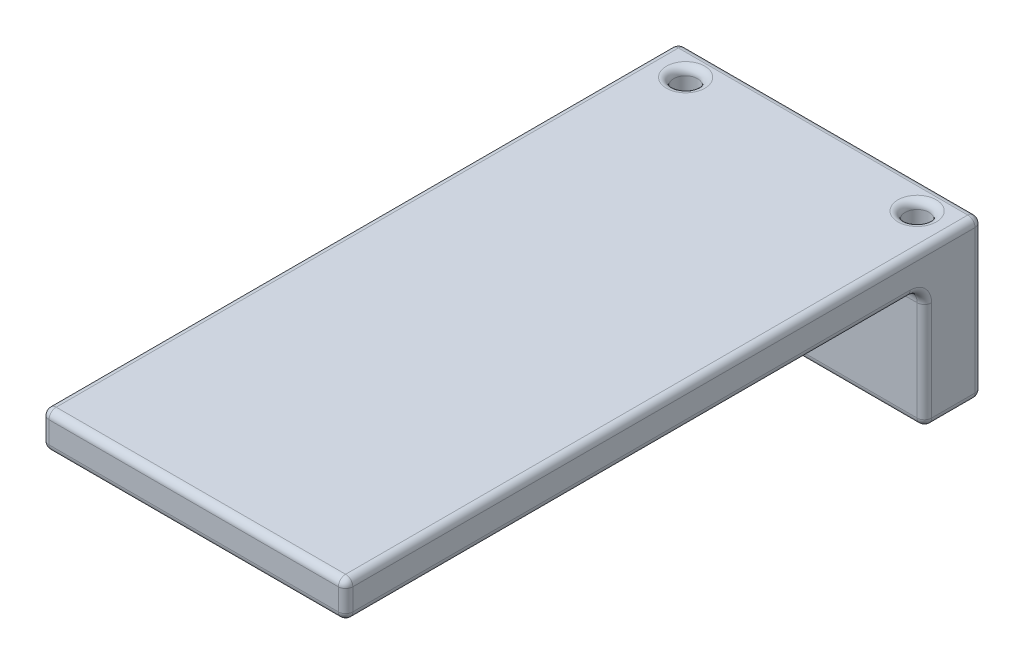
ISO-10303-21;
HEADER;
FILE_DESCRIPTION(('STEP AP214'),'2;1');
FILE_NAME('part.step','',(''),(''),'','','');
FILE_SCHEMA(('AUTOMOTIVE_DESIGN { 1 0 10303 214 1 1 1 1 }'));
ENDSEC;
DATA;
#1=APPLICATION_CONTEXT('core data for automotive mechanical design processes');
#2=APPLICATION_PROTOCOL_DEFINITION('international standard','automotive_design',2000,#1);
#3=PRODUCT_CONTEXT('',#1,'mechanical');
#4=PRODUCT('Part','Part','',(#3));
#5=PRODUCT_RELATED_PRODUCT_CATEGORY('part','',(#4));
#6=PRODUCT_DEFINITION_FORMATION('','',#4);
#7=PRODUCT_DEFINITION_CONTEXT('part definition',#1,'design');
#8=PRODUCT_DEFINITION('design','',#6,#7);
#9=PRODUCT_DEFINITION_SHAPE('','',#8);
#10=(LENGTH_UNIT() NAMED_UNIT(*) SI_UNIT(.MILLI.,.METRE.));
#11=(NAMED_UNIT(*) PLANE_ANGLE_UNIT() SI_UNIT($,.RADIAN.));
#12=(NAMED_UNIT(*) SI_UNIT($,.STERADIAN.) SOLID_ANGLE_UNIT());
#13=UNCERTAINTY_MEASURE_WITH_UNIT(LENGTH_MEASURE(1.E-05),#10,'distance_accuracy_value','');
#14=(GEOMETRIC_REPRESENTATION_CONTEXT(3) GLOBAL_UNCERTAINTY_ASSIGNED_CONTEXT((#13)) GLOBAL_UNIT_ASSIGNED_CONTEXT((#10,
#11,#12)) REPRESENTATION_CONTEXT('',''));
#15=CARTESIAN_POINT('',(0.,0.,0.));
#16=DIRECTION('',(0.,0.,1.));
#17=DIRECTION('',(1.,0.,0.));
#18=AXIS2_PLACEMENT_3D('',#15,#16,#17);
#19=CARTESIAN_POINT('',(21.,5.,40.));
#20=DIRECTION('',(-1.,0.,0.));
#21=DIRECTION('',(0.,0.,1.));
#22=AXIS2_PLACEMENT_3D('',#19,#20,#21);
#23=PLANE('',#22);
#24=DIRECTION('',(0.,0.,1.));
#25=VECTOR('',#24,1.);
#26=CARTESIAN_POINT('',(21.,-15.8,40.));
#27=LINE('',#26,#25);
#28=CARTESIAN_POINT('',(21.,-15.8,-41.));
#29=VERTEX_POINT('',#28);
#30=CARTESIAN_POINT('',(21.,-15.8,-47.));
#31=VERTEX_POINT('',#30);
#32=EDGE_CURVE('E370',#29,#31,#27,.F.);
#33=ORIENTED_EDGE('',*,*,#32,.T.);
#34=DIRECTION('',(0.,1.,0.));
#35=VECTOR('',#34,1.);
#36=CARTESIAN_POINT('',(21.,5.,-47.));
#37=LINE('',#36,#35);
#38=CARTESIAN_POINT('',(21.,4.,-47.));
#39=VERTEX_POINT('',#38);
#40=EDGE_CURVE('E372',#31,#39,#37,.T.);
#41=ORIENTED_EDGE('',*,*,#40,.T.);
#42=DIRECTION('',(0.,0.,-1.));
#43=VECTOR('',#42,1.);
#44=CARTESIAN_POINT('',(21.,4.,40.));
#45=LINE('',#44,#43);
#46=CARTESIAN_POINT('',(21.,4.,39.));
#47=VERTEX_POINT('',#46);
#48=EDGE_CURVE('E366',#39,#47,#45,.F.);
#49=ORIENTED_EDGE('',*,*,#48,.T.);
#50=DIRECTION('',(0.,-1.,0.));
#51=VECTOR('',#50,1.);
#52=CARTESIAN_POINT('',(21.,5.,39.));
#53=LINE('',#52,#51);
#54=CARTESIAN_POINT('',(21.,1.,39.));
#55=VERTEX_POINT('',#54);
#56=EDGE_CURVE('E355',#47,#55,#53,.T.);
#57=ORIENTED_EDGE('',*,*,#56,.T.);
#58=DIRECTION('',(0.,0.,-1.));
#59=VECTOR('',#58,1.);
#60=CARTESIAN_POINT('',(21.,1.,-38.));
#61=LINE('',#60,#59);
#62=CARTESIAN_POINT('',(21.,1.,-38.));
#63=VERTEX_POINT('',#62);
#64=EDGE_CURVE('E357',#55,#63,#61,.T.);
#65=ORIENTED_EDGE('',*,*,#64,.T.);
#66=CARTESIAN_POINT('',(21.,-2.,-38.));
#67=DIRECTION('',(-1.,0.,0.));
#68=DIRECTION('',(0.,0.,1.));
#69=AXIS2_PLACEMENT_3D('',#66,#67,#68);
#70=CIRCLE('',#69,3.);
#71=CARTESIAN_POINT('',(21.,-2.,-41.));
#72=VERTEX_POINT('',#71);
#73=EDGE_CURVE('E360',#63,#72,#70,.T.);
#74=ORIENTED_EDGE('',*,*,#73,.T.);
#75=DIRECTION('',(0.,1.,0.));
#76=VECTOR('',#75,1.);
#77=CARTESIAN_POINT('',(21.,-16.8,-41.));
#78=LINE('',#77,#76);
#79=EDGE_CURVE('E363',#72,#29,#78,.F.);
#80=ORIENTED_EDGE('',*,*,#79,.T.);
#81=EDGE_LOOP('',(#33,#41,#49,#57,#65,#74,#80));
#82=FACE_BOUND('',#81,.T.);
#83=ADVANCED_FACE('F45',(#82),#23,.F.);
#84=CARTESIAN_POINT('',(-21.,5.,40.));
#85=DIRECTION('',(1.,0.,0.));
#86=DIRECTION('',(0.,0.,-1.));
#87=AXIS2_PLACEMENT_3D('',#84,#85,#86);
#88=PLANE('',#87);
#89=DIRECTION('',(0.,1.,0.));
#90=VECTOR('',#89,1.);
#91=CARTESIAN_POINT('',(-21.,-16.8,-47.));
#92=LINE('',#91,#90);
#93=CARTESIAN_POINT('',(-21.,4.,-47.));
#94=VERTEX_POINT('',#93);
#95=CARTESIAN_POINT('',(-21.,-15.8,-47.));
#96=VERTEX_POINT('',#95);
#97=EDGE_CURVE('E299',#94,#96,#92,.F.);
#98=ORIENTED_EDGE('',*,*,#97,.T.);
#99=DIRECTION('',(0.,0.,-1.));
#100=VECTOR('',#99,1.);
#101=CARTESIAN_POINT('',(-21.,-15.8,40.));
#102=LINE('',#101,#100);
#103=CARTESIAN_POINT('',(-21.,-15.8,-41.));
#104=VERTEX_POINT('',#103);
#105=EDGE_CURVE('E309',#96,#104,#102,.F.);
#106=ORIENTED_EDGE('',*,*,#105,.T.);
#107=DIRECTION('',(0.,1.,0.));
#108=VECTOR('',#107,1.);
#109=CARTESIAN_POINT('',(-21.,-2.,-41.));
#110=LINE('',#109,#108);
#111=CARTESIAN_POINT('',(-21.,-2.,-41.));
#112=VERTEX_POINT('',#111);
#113=EDGE_CURVE('E305',#104,#112,#110,.T.);
#114=ORIENTED_EDGE('',*,*,#113,.T.);
#115=CARTESIAN_POINT('',(-21.,-2.,-38.));
#116=DIRECTION('',(1.,0.,0.));
#117=DIRECTION('',(0.,0.,-1.));
#118=AXIS2_PLACEMENT_3D('',#115,#116,#117);
#119=CIRCLE('',#118,3.);
#120=CARTESIAN_POINT('',(-21.,1.,-38.));
#121=VERTEX_POINT('',#120);
#122=EDGE_CURVE('E302',#112,#121,#119,.T.);
#123=ORIENTED_EDGE('',*,*,#122,.T.);
#124=DIRECTION('',(0.,0.,1.));
#125=VECTOR('',#124,1.);
#126=CARTESIAN_POINT('',(-21.,1.,40.));
#127=LINE('',#126,#125);
#128=CARTESIAN_POINT('',(-21.,1.,39.));
#129=VERTEX_POINT('',#128);
#130=EDGE_CURVE('E193',#121,#129,#127,.T.);
#131=ORIENTED_EDGE('',*,*,#130,.T.);
#132=DIRECTION('',(0.,-1.,0.));
#133=VECTOR('',#132,1.);
#134=CARTESIAN_POINT('',(-21.,5.,39.));
#135=LINE('',#134,#133);
#136=CARTESIAN_POINT('',(-21.,4.,39.));
#137=VERTEX_POINT('',#136);
#138=EDGE_CURVE('E187',#129,#137,#135,.F.);
#139=ORIENTED_EDGE('',*,*,#138,.T.);
#140=DIRECTION('',(0.,0.,1.));
#141=VECTOR('',#140,1.);
#142=CARTESIAN_POINT('',(-21.,4.,40.));
#143=LINE('',#142,#141);
#144=EDGE_CURVE('E190',#137,#94,#143,.F.);
#145=ORIENTED_EDGE('',*,*,#144,.T.);
#146=EDGE_LOOP('',(#98,#106,#114,#123,#131,#139,#145));
#147=FACE_BOUND('',#146,.T.);
#148=ADVANCED_FACE('F189',(#147),#88,.F.);
#149=CARTESIAN_POINT('',(-21.,5.,40.));
#150=DIRECTION('',(0.,0.,-1.));
#151=DIRECTION('',(-1.,0.,0.));
#152=AXIS2_PLACEMENT_3D('',#149,#150,#151);
#153=PLANE('',#152);
#154=DIRECTION('',(1.,0.,0.));
#155=VECTOR('',#154,1.);
#156=CARTESIAN_POINT('',(-21.,4.,40.));
#157=LINE('',#156,#155);
#158=CARTESIAN_POINT('',(20.,4.,40.));
#159=VERTEX_POINT('',#158);
#160=CARTESIAN_POINT('',(-20.,4.,40.));
#161=VERTEX_POINT('',#160);
#162=EDGE_CURVE('E54',#159,#161,#157,.F.);
#163=ORIENTED_EDGE('',*,*,#162,.T.);
#164=DIRECTION('',(0.,-1.,0.));
#165=VECTOR('',#164,1.);
#166=CARTESIAN_POINT('',(-20.,5.,40.));
#167=LINE('',#166,#165);
#168=CARTESIAN_POINT('',(-20.,1.,40.));
#169=VERTEX_POINT('',#168);
#170=EDGE_CURVE('E11',#161,#169,#167,.T.);
#171=ORIENTED_EDGE('',*,*,#170,.T.);
#172=DIRECTION('',(1.,0.,0.));
#173=VECTOR('',#172,1.);
#174=CARTESIAN_POINT('',(21.,1.,40.));
#175=LINE('',#174,#173);
#176=CARTESIAN_POINT('',(20.,1.,40.));
#177=VERTEX_POINT('',#176);
#178=EDGE_CURVE('E412',#169,#177,#175,.T.);
#179=ORIENTED_EDGE('',*,*,#178,.T.);
#180=DIRECTION('',(0.,-1.,0.));
#181=VECTOR('',#180,1.);
#182=CARTESIAN_POINT('',(20.,5.,40.));
#183=LINE('',#182,#181);
#184=EDGE_CURVE('E65',#177,#159,#183,.F.);
#185=ORIENTED_EDGE('',*,*,#184,.T.);
#186=EDGE_LOOP('',(#163,#171,#179,#185));
#187=FACE_BOUND('',#186,.T.);
#188=ADVANCED_FACE('F524',(#187),#153,.F.);
#189=CARTESIAN_POINT('',(0.,5.,0.));
#190=DIRECTION('',(0.,-1.,0.));
#191=DIRECTION('',(0.,0.,-1.));
#192=AXIS2_PLACEMENT_3D('',#189,#190,#191);
#193=PLANE('',#192);
#194=CARTESIAN_POINT('',(16.,5.,-44.));
#195=DIRECTION('',(0.,-1.,0.));
#196=DIRECTION('',(0.,0.,-1.));
#197=AXIS2_PLACEMENT_3D('',#194,#195,#196);
#198=CIRCLE('',#197,2.65);
#199=CARTESIAN_POINT('',(16.,5.,-46.65));
#200=VERTEX_POINT('',#199);
#201=EDGE_CURVE('E340',#200,#200,#198,.T.);
#202=ORIENTED_EDGE('',*,*,#201,.T.);
#203=EDGE_LOOP('',(#202));
#204=FACE_BOUND('',#203,.T.);
#205=CARTESIAN_POINT('',(-16.,5.,-44.));
#206=DIRECTION('',(0.,-1.,0.));
#207=DIRECTION('',(0.,0.,-1.));
#208=AXIS2_PLACEMENT_3D('',#205,#206,#207);
#209=CIRCLE('',#208,2.65);
#210=CARTESIAN_POINT('',(-16.,5.,-46.65));
#211=VERTEX_POINT('',#210);
#212=EDGE_CURVE('E336',#211,#211,#209,.T.);
#213=ORIENTED_EDGE('',*,*,#212,.T.);
#214=EDGE_LOOP('',(#213));
#215=FACE_BOUND('',#214,.T.);
#216=DIRECTION('',(0.,0.,-1.));
#217=VECTOR('',#216,1.);
#218=CARTESIAN_POINT('',(20.,5.,0.));
#219=LINE('',#218,#217);
#220=CARTESIAN_POINT('',(20.,5.,39.));
#221=VERTEX_POINT('',#220);
#222=CARTESIAN_POINT('',(20.,5.,-47.));
#223=VERTEX_POINT('',#222);
#224=EDGE_CURVE('E329',#221,#223,#219,.T.);
#225=ORIENTED_EDGE('',*,*,#224,.T.);
#226=DIRECTION('',(-1.,0.,0.));
#227=VECTOR('',#226,1.);
#228=CARTESIAN_POINT('',(-21.,5.,-47.));
#229=LINE('',#228,#227);
#230=CARTESIAN_POINT('',(-20.,5.,-47.));
#231=VERTEX_POINT('',#230);
#232=EDGE_CURVE('E332',#223,#231,#229,.T.);
#233=ORIENTED_EDGE('',*,*,#232,.T.);
#234=DIRECTION('',(0.,0.,1.));
#235=VECTOR('',#234,1.);
#236=CARTESIAN_POINT('',(-20.,5.,0.));
#237=LINE('',#236,#235);
#238=CARTESIAN_POINT('',(-20.,5.,39.));
#239=VERTEX_POINT('',#238);
#240=EDGE_CURVE('E324',#231,#239,#237,.T.);
#241=ORIENTED_EDGE('',*,*,#240,.T.);
#242=DIRECTION('',(1.,0.,0.));
#243=VECTOR('',#242,1.);
#244=CARTESIAN_POINT('',(0.,5.,39.));
#245=LINE('',#244,#243);
#246=EDGE_CURVE('E327',#239,#221,#245,.T.);
#247=ORIENTED_EDGE('',*,*,#246,.T.);
#248=EDGE_LOOP('',(#225,#233,#241,#247));
#249=FACE_BOUND('',#248,.T.);
#250=ADVANCED_FACE('F504',(#204,#215,#249),#193,.F.);
#251=CARTESIAN_POINT('',(0.,0.,0.));
#252=DIRECTION('',(0.,-1.,0.));
#253=DIRECTION('',(0.,0.,-1.));
#254=AXIS2_PLACEMENT_3D('',#251,#252,#253);
#255=PLANE('',#254);
#256=DIRECTION('',(-1.,0.,0.));
#257=VECTOR('',#256,1.);
#258=CARTESIAN_POINT('',(21.,0.,-38.));
#259=LINE('',#258,#257);
#260=CARTESIAN_POINT('',(-20.,0.,-38.));
#261=VERTEX_POINT('',#260);
#262=CARTESIAN_POINT('',(20.,0.,-38.));
#263=VERTEX_POINT('',#262);
#264=EDGE_CURVE('E209',#261,#263,#259,.F.);
#265=ORIENTED_EDGE('',*,*,#264,.T.);
#266=DIRECTION('',(0.,0.,-1.));
#267=VECTOR('',#266,1.);
#268=CARTESIAN_POINT('',(20.,0.,40.));
#269=LINE('',#268,#267);
#270=CARTESIAN_POINT('',(20.,0.,39.));
#271=VERTEX_POINT('',#270);
#272=EDGE_CURVE('E409',#263,#271,#269,.F.);
#273=ORIENTED_EDGE('',*,*,#272,.T.);
#274=DIRECTION('',(1.,0.,0.));
#275=VECTOR('',#274,1.);
#276=CARTESIAN_POINT('',(-21.,0.,39.));
#277=LINE('',#276,#275);
#278=CARTESIAN_POINT('',(-20.,0.,39.));
#279=VERTEX_POINT('',#278);
#280=EDGE_CURVE('E404',#271,#279,#277,.F.);
#281=ORIENTED_EDGE('',*,*,#280,.T.);
#282=DIRECTION('',(0.,0.,1.));
#283=VECTOR('',#282,1.);
#284=CARTESIAN_POINT('',(-20.,0.,-38.));
#285=LINE('',#284,#283);
#286=EDGE_CURVE('E406',#279,#261,#285,.F.);
#287=ORIENTED_EDGE('',*,*,#286,.T.);
#288=EDGE_LOOP('',(#265,#273,#281,#287));
#289=FACE_BOUND('',#288,.T.);
#290=ADVANCED_FACE('F747',(#289),#255,.T.);
#291=CARTESIAN_POINT('',(-21.,-59.5551166528639,-40.));
#292=DIRECTION('',(0.,0.,1.));
#293=DIRECTION('',(1.,0.,0.));
#294=AXIS2_PLACEMENT_3D('',#291,#292,#293);
#295=PLANE('',#294);
#296=DIRECTION('',(-1.,0.,0.));
#297=VECTOR('',#296,1.);
#298=CARTESIAN_POINT('',(-21.,-2.,-40.));
#299=LINE('',#298,#297);
#300=CARTESIAN_POINT('',(20.,-2.,-40.));
#301=VERTEX_POINT('',#300);
#302=CARTESIAN_POINT('',(-20.,-2.,-40.));
#303=VERTEX_POINT('',#302);
#304=EDGE_CURVE('E279',#301,#303,#299,.T.);
#305=ORIENTED_EDGE('',*,*,#304,.T.);
#306=DIRECTION('',(0.,1.,0.));
#307=VECTOR('',#306,1.);
#308=CARTESIAN_POINT('',(-20.,-16.8,-40.));
#309=LINE('',#308,#307);
#310=CARTESIAN_POINT('',(-20.,-15.8,-40.));
#311=VERTEX_POINT('',#310);
#312=EDGE_CURVE('E316',#303,#311,#309,.F.);
#313=ORIENTED_EDGE('',*,*,#312,.T.);
#314=DIRECTION('',(-1.,0.,0.));
#315=VECTOR('',#314,1.);
#316=CARTESIAN_POINT('',(21.,-15.8,-40.));
#317=LINE('',#316,#315);
#318=CARTESIAN_POINT('',(20.,-15.8,-40.));
#319=VERTEX_POINT('',#318);
#320=EDGE_CURVE('E311',#311,#319,#317,.F.);
#321=ORIENTED_EDGE('',*,*,#320,.T.);
#322=DIRECTION('',(0.,1.,0.));
#323=VECTOR('',#322,1.);
#324=CARTESIAN_POINT('',(20.,-2.,-40.));
#325=LINE('',#324,#323);
#326=EDGE_CURVE('E313',#319,#301,#325,.T.);
#327=ORIENTED_EDGE('',*,*,#326,.T.);
#328=EDGE_LOOP('',(#305,#313,#321,#327));
#329=FACE_BOUND('',#328,.T.);
#330=ADVANCED_FACE('F760',(#329),#295,.T.);
#331=CARTESIAN_POINT('',(-21.,-59.5551166528639,-48.));
#332=DIRECTION('',(0.,0.,-1.));
#333=DIRECTION('',(-1.,0.,0.));
#334=AXIS2_PLACEMENT_3D('',#331,#332,#333);
#335=PLANE('',#334);
#336=DIRECTION('',(0.,1.,0.));
#337=VECTOR('',#336,1.);
#338=CARTESIAN_POINT('',(-20.,5.,-48.));
#339=LINE('',#338,#337);
#340=CARTESIAN_POINT('',(-20.,-15.8,-48.));
#341=VERTEX_POINT('',#340);
#342=CARTESIAN_POINT('',(-20.,4.,-48.));
#343=VERTEX_POINT('',#342);
#344=EDGE_CURVE('E348',#341,#343,#339,.T.);
#345=ORIENTED_EDGE('',*,*,#344,.T.);
#346=DIRECTION('',(-1.,0.,0.));
#347=VECTOR('',#346,1.);
#348=CARTESIAN_POINT('',(21.,4.,-48.));
#349=LINE('',#348,#347);
#350=CARTESIAN_POINT('',(20.,4.,-48.));
#351=VERTEX_POINT('',#350);
#352=EDGE_CURVE('E351',#343,#351,#349,.F.);
#353=ORIENTED_EDGE('',*,*,#352,.T.);
#354=DIRECTION('',(0.,1.,0.));
#355=VECTOR('',#354,1.);
#356=CARTESIAN_POINT('',(20.,-16.8,-48.));
#357=LINE('',#356,#355);
#358=CARTESIAN_POINT('',(20.,-15.8,-48.));
#359=VERTEX_POINT('',#358);
#360=EDGE_CURVE('E346',#351,#359,#357,.F.);
#361=ORIENTED_EDGE('',*,*,#360,.T.);
#362=DIRECTION('',(1.,0.,0.));
#363=VECTOR('',#362,1.);
#364=CARTESIAN_POINT('',(-21.,-15.8,-48.));
#365=LINE('',#364,#363);
#366=EDGE_CURVE('E344',#359,#341,#365,.F.);
#367=ORIENTED_EDGE('',*,*,#366,.T.);
#368=EDGE_LOOP('',(#345,#353,#361,#367));
#369=FACE_BOUND('',#368,.T.);
#370=ADVANCED_FACE('F489',(#369),#335,.T.);
#371=CARTESIAN_POINT('',(16.,-59.5551166528639,-44.));
#372=DIRECTION('',(0.,1.,0.));
#373=DIRECTION('',(0.,0.,1.));
#374=AXIS2_PLACEMENT_3D('',#371,#372,#373);
#375=CYLINDRICAL_SURFACE('',#374,1.65);
#376=CARTESIAN_POINT('',(16.,-15.8,-44.));
#377=DIRECTION('',(0.,1.,0.));
#378=DIRECTION('',(0.,0.,1.));
#379=AXIS2_PLACEMENT_3D('',#376,#377,#378);
#380=CIRCLE('',#379,1.65);
#381=CARTESIAN_POINT('',(16.,-15.8,-42.35));
#382=VERTEX_POINT('',#381);
#383=EDGE_CURVE('E379',#382,#382,#380,.F.);
#384=ORIENTED_EDGE('',*,*,#383,.T.);
#385=EDGE_LOOP('',(#384));
#386=FACE_BOUND('',#385,.T.);
#387=CARTESIAN_POINT('',(16.,4.,-44.));
#388=DIRECTION('',(0.,-1.,0.));
#389=DIRECTION('',(0.,0.,-1.));
#390=AXIS2_PLACEMENT_3D('',#387,#388,#389);
#391=CIRCLE('',#390,1.65);
#392=CARTESIAN_POINT('',(16.,4.,-45.65));
#393=VERTEX_POINT('',#392);
#394=EDGE_CURVE('E375',#393,#393,#391,.F.);
#395=ORIENTED_EDGE('',*,*,#394,.T.);
#396=EDGE_LOOP('',(#395));
#397=FACE_BOUND('',#396,.T.);
#398=ADVANCED_FACE('F769',(#386,#397),#375,.F.);
#399=CARTESIAN_POINT('',(-16.,-59.5551166528639,-44.));
#400=DIRECTION('',(0.,1.,0.));
#401=DIRECTION('',(0.,0.,1.));
#402=AXIS2_PLACEMENT_3D('',#399,#400,#401);
#403=CYLINDRICAL_SURFACE('',#402,1.65);
#404=CARTESIAN_POINT('',(-16.,-15.8,-44.));
#405=DIRECTION('',(0.,1.,0.));
#406=DIRECTION('',(0.,0.,1.));
#407=AXIS2_PLACEMENT_3D('',#404,#405,#406);
#408=CIRCLE('',#407,1.65);
#409=CARTESIAN_POINT('',(-16.,-15.8,-42.35));
#410=VERTEX_POINT('',#409);
#411=EDGE_CURVE('E401',#410,#410,#408,.F.);
#412=ORIENTED_EDGE('',*,*,#411,.T.);
#413=EDGE_LOOP('',(#412));
#414=FACE_BOUND('',#413,.T.);
#415=CARTESIAN_POINT('',(-16.,4.,-44.));
#416=DIRECTION('',(0.,-1.,0.));
#417=DIRECTION('',(0.,0.,-1.));
#418=AXIS2_PLACEMENT_3D('',#415,#416,#417);
#419=CIRCLE('',#418,1.65);
#420=CARTESIAN_POINT('',(-16.,4.,-45.65));
#421=VERTEX_POINT('',#420);
#422=EDGE_CURVE('E397',#421,#421,#419,.F.);
#423=ORIENTED_EDGE('',*,*,#422,.T.);
#424=EDGE_LOOP('',(#423));
#425=FACE_BOUND('',#424,.T.);
#426=ADVANCED_FACE('F775',(#414,#425),#403,.F.);
#427=CARTESIAN_POINT('',(0.,-16.8,9.99999999999999));
#428=DIRECTION('',(0.,1.,0.));
#429=DIRECTION('',(0.,0.,-1.));
#430=AXIS2_PLACEMENT_3D('',#427,#428,#429);
#431=PLANE('',#430);
#432=CARTESIAN_POINT('',(16.,-16.8,-44.));
#433=DIRECTION('',(0.,1.,0.));
#434=DIRECTION('',(0.,0.,1.));
#435=AXIS2_PLACEMENT_3D('',#432,#433,#434);
#436=CIRCLE('',#435,2.65);
#437=CARTESIAN_POINT('',(16.,-16.8,-41.35));
#438=VERTEX_POINT('',#437);
#439=EDGE_CURVE('E394',#438,#438,#436,.T.);
#440=ORIENTED_EDGE('',*,*,#439,.T.);
#441=EDGE_LOOP('',(#440));
#442=FACE_BOUND('',#441,.T.);
#443=CARTESIAN_POINT('',(-16.,-16.8,-44.));
#444=DIRECTION('',(0.,1.,0.));
#445=DIRECTION('',(0.,0.,1.));
#446=AXIS2_PLACEMENT_3D('',#443,#444,#445);
#447=CIRCLE('',#446,2.65);
#448=CARTESIAN_POINT('',(-16.,-16.8,-41.35));
#449=VERTEX_POINT('',#448);
#450=EDGE_CURVE('E391',#449,#449,#447,.T.);
#451=ORIENTED_EDGE('',*,*,#450,.T.);
#452=EDGE_LOOP('',(#451));
#453=FACE_BOUND('',#452,.T.);
#454=DIRECTION('',(0.,0.,1.));
#455=VECTOR('',#454,1.);
#456=CARTESIAN_POINT('',(20.,-16.8,9.99999999999999));
#457=LINE('',#456,#455);
#458=CARTESIAN_POINT('',(20.,-16.8,-47.));
#459=VERTEX_POINT('',#458);
#460=CARTESIAN_POINT('',(20.,-16.8,-41.));
#461=VERTEX_POINT('',#460);
#462=EDGE_CURVE('E386',#459,#461,#457,.T.);
#463=ORIENTED_EDGE('',*,*,#462,.T.);
#464=DIRECTION('',(-1.,0.,0.));
#465=VECTOR('',#464,1.);
#466=CARTESIAN_POINT('',(-21.,-16.8,-41.));
#467=LINE('',#466,#465);
#468=CARTESIAN_POINT('',(-20.,-16.8,-41.));
#469=VERTEX_POINT('',#468);
#470=EDGE_CURVE('E388',#461,#469,#467,.T.);
#471=ORIENTED_EDGE('',*,*,#470,.T.);
#472=DIRECTION('',(0.,0.,-1.));
#473=VECTOR('',#472,1.);
#474=CARTESIAN_POINT('',(-20.,-16.8,9.99999999999999));
#475=LINE('',#474,#473);
#476=CARTESIAN_POINT('',(-20.,-16.8,-47.));
#477=VERTEX_POINT('',#476);
#478=EDGE_CURVE('E382',#469,#477,#475,.T.);
#479=ORIENTED_EDGE('',*,*,#478,.T.);
#480=DIRECTION('',(1.,0.,0.));
#481=VECTOR('',#480,1.);
#482=CARTESIAN_POINT('',(21.,-16.8,-47.));
#483=LINE('',#482,#481);
#484=EDGE_CURVE('E384',#477,#459,#483,.T.);
#485=ORIENTED_EDGE('',*,*,#484,.T.);
#486=EDGE_LOOP('',(#463,#471,#479,#485));
#487=FACE_BOUND('',#486,.T.);
#488=ADVANCED_FACE('F467',(#442,#453,#487),#431,.F.);
#489=CARTESIAN_POINT('',(-21.,-2.,-38.));
#490=DIRECTION('',(1.,0.,0.));
#491=DIRECTION('',(0.,0.,-1.));
#492=AXIS2_PLACEMENT_3D('',#489,#490,#491);
#493=CYLINDRICAL_SURFACE('',#492,2.);
#494=ORIENTED_EDGE('',*,*,#264,.F.);
#495=CARTESIAN_POINT('',(-20.,-2.,-38.));
#496=DIRECTION('',(1.,0.,0.));
#497=DIRECTION('',(0.,0.,-1.));
#498=AXIS2_PLACEMENT_3D('',#495,#496,#497);
#499=CIRCLE('',#498,2.);
#500=EDGE_CURVE('E321',#261,#303,#499,.F.);
#501=ORIENTED_EDGE('',*,*,#500,.T.);
#502=ORIENTED_EDGE('',*,*,#304,.F.);
#503=CARTESIAN_POINT('',(20.,-2.,-38.));
#504=DIRECTION('',(-1.,0.,0.));
#505=DIRECTION('',(0.,0.,1.));
#506=AXIS2_PLACEMENT_3D('',#503,#504,#505);
#507=CIRCLE('',#506,2.);
#508=EDGE_CURVE('E318',#301,#263,#507,.F.);
#509=ORIENTED_EDGE('',*,*,#508,.T.);
#510=EDGE_LOOP('',(#494,#501,#502,#509));
#511=FACE_BOUND('',#510,.T.);
#512=ADVANCED_FACE('F517',(#511),#493,.F.);
#513=CARTESIAN_POINT('',(20.,4.,0.));
#514=DIRECTION('',(0.,0.,-1.));
#515=DIRECTION('',(-1.,0.,0.));
#516=AXIS2_PLACEMENT_3D('',#513,#514,#515);
#517=CYLINDRICAL_SURFACE('',#516,1.);
#518=CARTESIAN_POINT('',(20.,4.,-47.));
#519=DIRECTION('',(0.,0.,-1.));
#520=DIRECTION('',(-1.,0.,0.));
#521=AXIS2_PLACEMENT_3D('',#518,#519,#520);
#522=CIRCLE('',#521,1.);
#523=EDGE_CURVE('E49',#223,#39,#522,.T.);
#524=ORIENTED_EDGE('',*,*,#523,.F.);
#525=ORIENTED_EDGE('',*,*,#224,.F.);
#526=CARTESIAN_POINT('',(20.,4.,39.));
#527=DIRECTION('',(0.,0.,1.));
#528=DIRECTION('',(1.,0.,0.));
#529=AXIS2_PLACEMENT_3D('',#526,#527,#528);
#530=CIRCLE('',#529,1.);
#531=EDGE_CURVE('E271',#47,#221,#530,.T.);
#532=ORIENTED_EDGE('',*,*,#531,.F.);
#533=ORIENTED_EDGE('',*,*,#48,.F.);
#534=EDGE_LOOP('',(#524,#525,#532,#533));
#535=FACE_BOUND('',#534,.T.);
#536=ADVANCED_FACE('F507',(#535),#517,.T.);
#537=CARTESIAN_POINT('',(20.,4.,-47.));
#538=DIRECTION('',(1.,0.,0.));
#539=DIRECTION('',(0.,0.,-1.));
#540=AXIS2_PLACEMENT_3D('',#537,#538,#539);
#541=SPHERICAL_SURFACE('',#540,1.);
#542=CARTESIAN_POINT('',(20.,4.,-47.));
#543=DIRECTION('',(1.,0.,0.));
#544=DIRECTION('',(0.,0.,-1.));
#545=AXIS2_PLACEMENT_3D('',#542,#543,#544);
#546=CIRCLE('',#545,1.);
#547=EDGE_CURVE('E264',#223,#351,#546,.F.);
#548=ORIENTED_EDGE('',*,*,#547,.F.);
#549=ORIENTED_EDGE('',*,*,#523,.T.);
#550=CARTESIAN_POINT('',(20.,4.,-47.));
#551=DIRECTION('',(0.,1.,0.));
#552=DIRECTION('',(0.,0.,1.));
#553=AXIS2_PLACEMENT_3D('',#550,#551,#552);
#554=CIRCLE('',#553,1.);
#555=EDGE_CURVE('E268',#351,#39,#554,.F.);
#556=ORIENTED_EDGE('',*,*,#555,.F.);
#557=EDGE_LOOP('',(#548,#549,#556));
#558=FACE_BOUND('',#557,.T.);
#559=ADVANCED_FACE('F508',(#558),#541,.T.);
#560=CARTESIAN_POINT('',(20.,4.,39.));
#561=DIRECTION('',(0.,1.,0.));
#562=DIRECTION('',(0.,0.,1.));
#563=AXIS2_PLACEMENT_3D('',#560,#561,#562);
#564=SPHERICAL_SURFACE('',#563,1.);
#565=CARTESIAN_POINT('',(20.,4.,39.));
#566=DIRECTION('',(0.,1.,0.));
#567=DIRECTION('',(0.,0.,1.));
#568=AXIS2_PLACEMENT_3D('',#565,#566,#567);
#569=CIRCLE('',#568,1.);
#570=EDGE_CURVE('E259',#47,#159,#569,.F.);
#571=ORIENTED_EDGE('',*,*,#570,.F.);
#572=ORIENTED_EDGE('',*,*,#531,.T.);
#573=CARTESIAN_POINT('',(20.,4.,39.));
#574=DIRECTION('',(1.,0.,0.));
#575=DIRECTION('',(0.,0.,-1.));
#576=AXIS2_PLACEMENT_3D('',#573,#574,#575);
#577=CIRCLE('',#576,1.);
#578=EDGE_CURVE('E261',#159,#221,#577,.F.);
#579=ORIENTED_EDGE('',*,*,#578,.F.);
#580=EDGE_LOOP('',(#571,#572,#579));
#581=FACE_BOUND('',#580,.T.);
#582=ADVANCED_FACE('F510',(#581),#564,.T.);
#583=CARTESIAN_POINT('',(20.,5.,-47.));
#584=DIRECTION('',(0.,-1.,0.));
#585=DIRECTION('',(0.,0.,-1.));
#586=AXIS2_PLACEMENT_3D('',#583,#584,#585);
#587=CYLINDRICAL_SURFACE('',#586,1.);
#588=ORIENTED_EDGE('',*,*,#555,.T.);
#589=ORIENTED_EDGE('',*,*,#40,.F.);
#590=CARTESIAN_POINT('',(20.,-15.8,-47.));
#591=DIRECTION('',(0.,-1.,0.));
#592=DIRECTION('',(0.,0.,-1.));
#593=AXIS2_PLACEMENT_3D('',#590,#591,#592);
#594=CIRCLE('',#593,1.);
#595=EDGE_CURVE('E253',#359,#31,#594,.T.);
#596=ORIENTED_EDGE('',*,*,#595,.F.);
#597=ORIENTED_EDGE('',*,*,#360,.F.);
#598=EDGE_LOOP('',(#588,#589,#596,#597));
#599=FACE_BOUND('',#598,.T.);
#600=ADVANCED_FACE('F479',(#599),#587,.T.);
#601=CARTESIAN_POINT('',(0.,4.,-47.));
#602=DIRECTION('',(1.,0.,0.));
#603=DIRECTION('',(0.,0.,-1.));
#604=AXIS2_PLACEMENT_3D('',#601,#602,#603);
#605=CYLINDRICAL_SURFACE('',#604,1.);
#606=ORIENTED_EDGE('',*,*,#547,.T.);
#607=ORIENTED_EDGE('',*,*,#352,.F.);
#608=CARTESIAN_POINT('',(-20.,4.,-47.));
#609=DIRECTION('',(-1.,0.,0.));
#610=DIRECTION('',(0.,0.,1.));
#611=AXIS2_PLACEMENT_3D('',#608,#609,#610);
#612=CIRCLE('',#611,1.);
#613=EDGE_CURVE('E249',#231,#343,#612,.T.);
#614=ORIENTED_EDGE('',*,*,#613,.F.);
#615=ORIENTED_EDGE('',*,*,#232,.F.);
#616=EDGE_LOOP('',(#606,#607,#614,#615));
#617=FACE_BOUND('',#616,.T.);
#618=ADVANCED_FACE('F501',(#617),#605,.T.);
#619=CARTESIAN_POINT('',(-20.,4.,0.));
#620=DIRECTION('',(0.,0.,1.));
#621=DIRECTION('',(1.,0.,0.));
#622=AXIS2_PLACEMENT_3D('',#619,#620,#621);
#623=CYLINDRICAL_SURFACE('',#622,1.);
#624=CARTESIAN_POINT('',(-20.,4.,39.));
#625=DIRECTION('',(0.,0.,1.));
#626=DIRECTION('',(1.,0.,0.));
#627=AXIS2_PLACEMENT_3D('',#624,#625,#626);
#628=CIRCLE('',#627,1.);
#629=EDGE_CURVE('E204',#239,#137,#628,.T.);
#630=ORIENTED_EDGE('',*,*,#629,.F.);
#631=ORIENTED_EDGE('',*,*,#240,.F.);
#632=CARTESIAN_POINT('',(-20.,4.,-47.));
#633=DIRECTION('',(0.,0.,-1.));
#634=DIRECTION('',(-1.,0.,0.));
#635=AXIS2_PLACEMENT_3D('',#632,#633,#634);
#636=CIRCLE('',#635,1.);
#637=EDGE_CURVE('E206',#94,#231,#636,.T.);
#638=ORIENTED_EDGE('',*,*,#637,.F.);
#639=ORIENTED_EDGE('',*,*,#144,.F.);
#640=EDGE_LOOP('',(#630,#631,#638,#639));
#641=FACE_BOUND('',#640,.T.);
#642=ADVANCED_FACE('F202',(#641),#623,.T.);
#643=CARTESIAN_POINT('',(0.,4.,39.));
#644=DIRECTION('',(1.,0.,0.));
#645=DIRECTION('',(0.,0.,-1.));
#646=AXIS2_PLACEMENT_3D('',#643,#644,#645);
#647=CYLINDRICAL_SURFACE('',#646,1.);
#648=ORIENTED_EDGE('',*,*,#578,.T.);
#649=ORIENTED_EDGE('',*,*,#246,.F.);
#650=CARTESIAN_POINT('',(-20.,4.,39.));
#651=DIRECTION('',(-1.,0.,0.));
#652=DIRECTION('',(0.,0.,1.));
#653=AXIS2_PLACEMENT_3D('',#650,#651,#652);
#654=CIRCLE('',#653,1.);
#655=EDGE_CURVE('E216',#161,#239,#654,.T.);
#656=ORIENTED_EDGE('',*,*,#655,.F.);
#657=ORIENTED_EDGE('',*,*,#162,.F.);
#658=EDGE_LOOP('',(#648,#649,#656,#657));
#659=FACE_BOUND('',#658,.T.);
#660=ADVANCED_FACE('F600',(#659),#647,.T.);
#661=CARTESIAN_POINT('',(20.,5.,39.));
#662=DIRECTION('',(0.,-1.,0.));
#663=DIRECTION('',(0.,0.,-1.));
#664=AXIS2_PLACEMENT_3D('',#661,#662,#663);
#665=CYLINDRICAL_SURFACE('',#664,1.);
#666=ORIENTED_EDGE('',*,*,#570,.T.);
#667=ORIENTED_EDGE('',*,*,#184,.F.);
#668=CARTESIAN_POINT('',(20.,1.,39.));
#669=DIRECTION('',(0.,-1.,0.));
#670=DIRECTION('',(0.,0.,-1.));
#671=AXIS2_PLACEMENT_3D('',#668,#669,#670);
#672=CIRCLE('',#671,1.);
#673=EDGE_CURVE('E243',#55,#177,#672,.T.);
#674=ORIENTED_EDGE('',*,*,#673,.F.);
#675=ORIENTED_EDGE('',*,*,#56,.F.);
#676=EDGE_LOOP('',(#666,#667,#674,#675));
#677=FACE_BOUND('',#676,.T.);
#678=ADVANCED_FACE('F596',(#677),#665,.T.);
#679=CARTESIAN_POINT('',(20.,1.,40.));
#680=DIRECTION('',(0.,0.,1.));
#681=DIRECTION('',(1.,0.,0.));
#682=AXIS2_PLACEMENT_3D('',#679,#680,#681);
#683=CYLINDRICAL_SURFACE('',#682,1.);
#684=CARTESIAN_POINT('',(20.,1.,39.));
#685=DIRECTION('',(0.,0.,1.));
#686=DIRECTION('',(1.,0.,0.));
#687=AXIS2_PLACEMENT_3D('',#684,#685,#686);
#688=CIRCLE('',#687,1.);
#689=EDGE_CURVE('E240',#271,#55,#688,.T.);
#690=ORIENTED_EDGE('',*,*,#689,.F.);
#691=ORIENTED_EDGE('',*,*,#272,.F.);
#692=CARTESIAN_POINT('',(20.,1.,-38.));
#693=DIRECTION('',(0.,0.,-1.));
#694=DIRECTION('',(-1.,0.,0.));
#695=AXIS2_PLACEMENT_3D('',#692,#693,#694);
#696=CIRCLE('',#695,1.);
#697=EDGE_CURVE('E256',#63,#263,#696,.T.);
#698=ORIENTED_EDGE('',*,*,#697,.F.);
#699=ORIENTED_EDGE('',*,*,#64,.F.);
#700=EDGE_LOOP('',(#690,#691,#698,#699));
#701=FACE_BOUND('',#700,.T.);
#702=ADVANCED_FACE('F592',(#701),#683,.T.);
#703=CARTESIAN_POINT('',(20.,-2.,-38.));
#704=DIRECTION('',(-1.,0.,0.));
#705=DIRECTION('',(0.,0.,1.));
#706=AXIS2_PLACEMENT_3D('',#703,#704,#705);
#707=TOROIDAL_SURFACE('',#706,3.,1.);
#708=ORIENTED_EDGE('',*,*,#697,.T.);
#709=ORIENTED_EDGE('',*,*,#508,.F.);
#710=CARTESIAN_POINT('',(20.,-2.,-41.));
#711=DIRECTION('',(0.,-1.,0.));
#712=DIRECTION('',(0.,0.,-1.));
#713=AXIS2_PLACEMENT_3D('',#710,#711,#712);
#714=CIRCLE('',#713,1.);
#715=EDGE_CURVE('E236',#72,#301,#714,.T.);
#716=ORIENTED_EDGE('',*,*,#715,.F.);
#717=ORIENTED_EDGE('',*,*,#73,.F.);
#718=EDGE_LOOP('',(#708,#709,#716,#717));
#719=FACE_BOUND('',#718,.T.);
#720=ADVANCED_FACE('F589',(#719),#707,.T.);
#721=CARTESIAN_POINT('',(20.,-15.8,-47.));
#722=DIRECTION('',(1.,0.,0.));
#723=DIRECTION('',(0.,0.,-1.));
#724=AXIS2_PLACEMENT_3D('',#721,#722,#723);
#725=SPHERICAL_SURFACE('',#724,1.);
#726=CARTESIAN_POINT('',(20.,-15.8,-47.));
#727=DIRECTION('',(1.,0.,0.));
#728=DIRECTION('',(0.,0.,-1.));
#729=AXIS2_PLACEMENT_3D('',#726,#727,#728);
#730=CIRCLE('',#729,1.);
#731=EDGE_CURVE('E224',#359,#459,#730,.F.);
#732=ORIENTED_EDGE('',*,*,#731,.F.);
#733=ORIENTED_EDGE('',*,*,#595,.T.);
#734=CARTESIAN_POINT('',(20.,-15.8,-47.));
#735=DIRECTION('',(0.,0.,-1.));
#736=DIRECTION('',(0.,1.,0.));
#737=AXIS2_PLACEMENT_3D('',#734,#735,#736);
#738=CIRCLE('',#737,1.);
#739=EDGE_CURVE('E233',#459,#31,#738,.F.);
#740=ORIENTED_EDGE('',*,*,#739,.F.);
#741=EDGE_LOOP('',(#732,#733,#740));
#742=FACE_BOUND('',#741,.T.);
#743=ADVANCED_FACE('F482',(#742),#725,.T.);
#744=CARTESIAN_POINT('',(-20.,4.,-47.));
#745=DIRECTION('',(0.,1.,0.));
#746=DIRECTION('',(0.,0.,1.));
#747=AXIS2_PLACEMENT_3D('',#744,#745,#746);
#748=SPHERICAL_SURFACE('',#747,1.);
#749=ORIENTED_EDGE('',*,*,#637,.T.);
#750=ORIENTED_EDGE('',*,*,#613,.T.);
#751=CARTESIAN_POINT('',(-20.,4.,-47.));
#752=DIRECTION('',(0.,1.,0.));
#753=DIRECTION('',(0.,0.,1.));
#754=AXIS2_PLACEMENT_3D('',#751,#752,#753);
#755=CIRCLE('',#754,1.);
#756=EDGE_CURVE('E219',#94,#343,#755,.F.);
#757=ORIENTED_EDGE('',*,*,#756,.F.);
#758=EDGE_LOOP('',(#749,#750,#757));
#759=FACE_BOUND('',#758,.T.);
#760=ADVANCED_FACE('F497',(#759),#748,.T.);
#761=CARTESIAN_POINT('',(-20.,4.,39.));
#762=DIRECTION('',(0.,1.,0.));
#763=DIRECTION('',(0.,0.,1.));
#764=AXIS2_PLACEMENT_3D('',#761,#762,#763);
#765=SPHERICAL_SURFACE('',#764,1.);
#766=ORIENTED_EDGE('',*,*,#655,.T.);
#767=ORIENTED_EDGE('',*,*,#629,.T.);
#768=CARTESIAN_POINT('',(-20.,4.,39.));
#769=DIRECTION('',(0.,1.,0.));
#770=DIRECTION('',(0.,0.,1.));
#771=AXIS2_PLACEMENT_3D('',#768,#769,#770);
#772=CIRCLE('',#771,1.);
#773=EDGE_CURVE('E214',#161,#137,#772,.F.);
#774=ORIENTED_EDGE('',*,*,#773,.F.);
#775=EDGE_LOOP('',(#766,#767,#774));
#776=FACE_BOUND('',#775,.T.);
#777=ADVANCED_FACE('F213',(#776),#765,.T.);
#778=CARTESIAN_POINT('',(20.,1.,39.));
#779=DIRECTION('',(1.,0.,0.));
#780=DIRECTION('',(0.,0.,-1.));
#781=AXIS2_PLACEMENT_3D('',#778,#779,#780);
#782=SPHERICAL_SURFACE('',#781,1.);
#783=ORIENTED_EDGE('',*,*,#689,.T.);
#784=ORIENTED_EDGE('',*,*,#673,.T.);
#785=CARTESIAN_POINT('',(20.,1.,39.));
#786=DIRECTION('',(1.,0.,0.));
#787=DIRECTION('',(0.,0.,-1.));
#788=AXIS2_PLACEMENT_3D('',#785,#786,#787);
#789=CIRCLE('',#788,1.);
#790=EDGE_CURVE('E220',#271,#177,#789,.F.);
#791=ORIENTED_EDGE('',*,*,#790,.F.);
#792=EDGE_LOOP('',(#783,#784,#791));
#793=FACE_BOUND('',#792,.T.);
#794=ADVANCED_FACE('F579',(#793),#782,.T.);
#795=CARTESIAN_POINT('',(20.,-59.5551166528639,-41.));
#796=DIRECTION('',(0.,-1.,0.));
#797=DIRECTION('',(0.,0.,-1.));
#798=AXIS2_PLACEMENT_3D('',#795,#796,#797);
#799=CYLINDRICAL_SURFACE('',#798,1.);
#800=ORIENTED_EDGE('',*,*,#715,.T.);
#801=ORIENTED_EDGE('',*,*,#326,.F.);
#802=CARTESIAN_POINT('',(20.,-15.8,-41.));
#803=DIRECTION('',(0.,-1.,0.));
#804=DIRECTION('',(0.,0.,-1.));
#805=AXIS2_PLACEMENT_3D('',#802,#803,#804);
#806=CIRCLE('',#805,1.);
#807=EDGE_CURVE('E227',#29,#319,#806,.T.);
#808=ORIENTED_EDGE('',*,*,#807,.F.);
#809=ORIENTED_EDGE('',*,*,#79,.F.);
#810=EDGE_LOOP('',(#800,#801,#808,#809));
#811=FACE_BOUND('',#810,.T.);
#812=ADVANCED_FACE('F576',(#811),#799,.T.);
#813=CARTESIAN_POINT('',(20.,-15.8,9.99999999999999));
#814=DIRECTION('',(0.,0.,1.));
#815=DIRECTION('',(1.,0.,0.));
#816=AXIS2_PLACEMENT_3D('',#813,#814,#815);
#817=CYLINDRICAL_SURFACE('',#816,1.);
#818=ORIENTED_EDGE('',*,*,#739,.T.);
#819=ORIENTED_EDGE('',*,*,#32,.F.);
#820=CARTESIAN_POINT('',(20.,-15.8,-41.));
#821=DIRECTION('',(0.,0.,1.));
#822=DIRECTION('',(1.,0.,0.));
#823=AXIS2_PLACEMENT_3D('',#820,#821,#822);
#824=CIRCLE('',#823,1.);
#825=EDGE_CURVE('E449',#461,#29,#824,.T.);
#826=ORIENTED_EDGE('',*,*,#825,.F.);
#827=ORIENTED_EDGE('',*,*,#462,.F.);
#828=EDGE_LOOP('',(#818,#819,#826,#827));
#829=FACE_BOUND('',#828,.T.);
#830=ADVANCED_FACE('F472',(#829),#817,.T.);
#831=CARTESIAN_POINT('',(0.,-15.8,-47.));
#832=DIRECTION('',(-1.,0.,0.));
#833=DIRECTION('',(0.,0.,1.));
#834=AXIS2_PLACEMENT_3D('',#831,#832,#833);
#835=CYLINDRICAL_SURFACE('',#834,1.);
#836=ORIENTED_EDGE('',*,*,#731,.T.);
#837=ORIENTED_EDGE('',*,*,#484,.F.);
#838=CARTESIAN_POINT('',(-20.,-15.8,-47.));
#839=DIRECTION('',(-1.,0.,0.));
#840=DIRECTION('',(0.,0.,1.));
#841=AXIS2_PLACEMENT_3D('',#838,#839,#840);
#842=CIRCLE('',#841,1.);
#843=EDGE_CURVE('E446',#341,#477,#842,.T.);
#844=ORIENTED_EDGE('',*,*,#843,.F.);
#845=ORIENTED_EDGE('',*,*,#366,.F.);
#846=EDGE_LOOP('',(#836,#837,#844,#845));
#847=FACE_BOUND('',#846,.T.);
#848=ADVANCED_FACE('F486',(#847),#835,.T.);
#849=CARTESIAN_POINT('',(-20.,-59.5551166528639,-47.));
#850=DIRECTION('',(0.,-1.,0.));
#851=DIRECTION('',(0.,0.,-1.));
#852=AXIS2_PLACEMENT_3D('',#849,#850,#851);
#853=CYLINDRICAL_SURFACE('',#852,1.);
#854=ORIENTED_EDGE('',*,*,#756,.T.);
#855=ORIENTED_EDGE('',*,*,#344,.F.);
#856=CARTESIAN_POINT('',(-20.,-15.8,-47.));
#857=DIRECTION('',(0.,-1.,0.));
#858=DIRECTION('',(0.,0.,-1.));
#859=AXIS2_PLACEMENT_3D('',#856,#857,#858);
#860=CIRCLE('',#859,1.);
#861=EDGE_CURVE('E443',#96,#341,#860,.T.);
#862=ORIENTED_EDGE('',*,*,#861,.F.);
#863=ORIENTED_EDGE('',*,*,#97,.F.);
#864=EDGE_LOOP('',(#854,#855,#862,#863));
#865=FACE_BOUND('',#864,.T.);
#866=ADVANCED_FACE('F493',(#865),#853,.T.);
#867=CARTESIAN_POINT('',(-20.,5.,39.));
#868=DIRECTION('',(0.,-1.,0.));
#869=DIRECTION('',(0.,0.,-1.));
#870=AXIS2_PLACEMENT_3D('',#867,#868,#869);
#871=CYLINDRICAL_SURFACE('',#870,1.);
#872=ORIENTED_EDGE('',*,*,#773,.T.);
#873=ORIENTED_EDGE('',*,*,#138,.F.);
#874=CARTESIAN_POINT('',(-20.,1.,39.));
#875=DIRECTION('',(0.,-1.,0.));
#876=DIRECTION('',(0.,0.,-1.));
#877=AXIS2_PLACEMENT_3D('',#874,#875,#876);
#878=CIRCLE('',#877,1.);
#879=EDGE_CURVE('E441',#169,#129,#878,.T.);
#880=ORIENTED_EDGE('',*,*,#879,.F.);
#881=ORIENTED_EDGE('',*,*,#170,.F.);
#882=EDGE_LOOP('',(#872,#873,#880,#881));
#883=FACE_BOUND('',#882,.T.);
#884=ADVANCED_FACE('F218',(#883),#871,.T.);
#885=CARTESIAN_POINT('',(-21.,1.,39.));
#886=DIRECTION('',(-1.,0.,0.));
#887=DIRECTION('',(0.,0.,1.));
#888=AXIS2_PLACEMENT_3D('',#885,#886,#887);
#889=CYLINDRICAL_SURFACE('',#888,1.);
#890=ORIENTED_EDGE('',*,*,#790,.T.);
#891=ORIENTED_EDGE('',*,*,#178,.F.);
#892=CARTESIAN_POINT('',(-20.,1.,39.));
#893=DIRECTION('',(-1.,0.,0.));
#894=DIRECTION('',(0.,0.,1.));
#895=AXIS2_PLACEMENT_3D('',#892,#893,#894);
#896=CIRCLE('',#895,1.);
#897=EDGE_CURVE('E439',#279,#169,#896,.T.);
#898=ORIENTED_EDGE('',*,*,#897,.F.);
#899=ORIENTED_EDGE('',*,*,#280,.F.);
#900=EDGE_LOOP('',(#890,#891,#898,#899));
#901=FACE_BOUND('',#900,.T.);
#902=ADVANCED_FACE('F564',(#901),#889,.T.);
#903=CARTESIAN_POINT('',(20.,-15.8,-41.));
#904=DIRECTION('',(1.,0.,0.));
#905=DIRECTION('',(0.,0.,-1.));
#906=AXIS2_PLACEMENT_3D('',#903,#904,#905);
#907=SPHERICAL_SURFACE('',#906,1.);
#908=ORIENTED_EDGE('',*,*,#825,.T.);
#909=ORIENTED_EDGE('',*,*,#807,.T.);
#910=CARTESIAN_POINT('',(20.,-15.8,-41.));
#911=DIRECTION('',(1.,0.,0.));
#912=DIRECTION('',(0.,0.,-1.));
#913=AXIS2_PLACEMENT_3D('',#910,#911,#912);
#914=CIRCLE('',#913,1.);
#915=EDGE_CURVE('E436',#461,#319,#914,.F.);
#916=ORIENTED_EDGE('',*,*,#915,.F.);
#917=EDGE_LOOP('',(#908,#909,#916));
#918=FACE_BOUND('',#917,.T.);
#919=ADVANCED_FACE('F455',(#918),#907,.T.);
#920=CARTESIAN_POINT('',(-20.,-15.8,-47.));
#921=DIRECTION('',(0.,0.,-1.));
#922=DIRECTION('',(-1.,0.,0.));
#923=AXIS2_PLACEMENT_3D('',#920,#921,#922);
#924=SPHERICAL_SURFACE('',#923,1.);
#925=ORIENTED_EDGE('',*,*,#861,.T.);
#926=ORIENTED_EDGE('',*,*,#843,.T.);
#927=CARTESIAN_POINT('',(-20.,-15.8,-47.));
#928=DIRECTION('',(0.,0.,-1.));
#929=DIRECTION('',(-1.,0.,0.));
#930=AXIS2_PLACEMENT_3D('',#927,#928,#929);
#931=CIRCLE('',#930,1.);
#932=EDGE_CURVE('E433',#96,#477,#931,.F.);
#933=ORIENTED_EDGE('',*,*,#932,.F.);
#934=EDGE_LOOP('',(#925,#926,#933));
#935=FACE_BOUND('',#934,.T.);
#936=ADVANCED_FACE('F557',(#935),#924,.T.);
#937=CARTESIAN_POINT('',(-20.,1.,39.));
#938=DIRECTION('',(0.,0.,1.));
#939=DIRECTION('',(1.,0.,0.));
#940=AXIS2_PLACEMENT_3D('',#937,#938,#939);
#941=SPHERICAL_SURFACE('',#940,1.);
#942=ORIENTED_EDGE('',*,*,#897,.T.);
#943=ORIENTED_EDGE('',*,*,#879,.T.);
#944=CARTESIAN_POINT('',(-20.,1.,39.));
#945=DIRECTION('',(0.,0.,1.));
#946=DIRECTION('',(1.,0.,0.));
#947=AXIS2_PLACEMENT_3D('',#944,#945,#946);
#948=CIRCLE('',#947,1.);
#949=EDGE_CURVE('E430',#279,#129,#948,.F.);
#950=ORIENTED_EDGE('',*,*,#949,.F.);
#951=EDGE_LOOP('',(#942,#943,#950));
#952=FACE_BOUND('',#951,.T.);
#953=ADVANCED_FACE('F554',(#952),#941,.T.);
#954=CARTESIAN_POINT('',(0.,-15.8,-41.));
#955=DIRECTION('',(1.,0.,0.));
#956=DIRECTION('',(0.,0.,-1.));
#957=AXIS2_PLACEMENT_3D('',#954,#955,#956);
#958=CYLINDRICAL_SURFACE('',#957,1.);
#959=ORIENTED_EDGE('',*,*,#915,.T.);
#960=ORIENTED_EDGE('',*,*,#320,.F.);
#961=CARTESIAN_POINT('',(-20.,-15.8,-41.));
#962=DIRECTION('',(-1.,0.,0.));
#963=DIRECTION('',(0.,0.,1.));
#964=AXIS2_PLACEMENT_3D('',#961,#962,#963);
#965=CIRCLE('',#964,1.);
#966=EDGE_CURVE('E427',#469,#311,#965,.T.);
#967=ORIENTED_EDGE('',*,*,#966,.F.);
#968=ORIENTED_EDGE('',*,*,#470,.F.);
#969=EDGE_LOOP('',(#959,#960,#967,#968));
#970=FACE_BOUND('',#969,.T.);
#971=ADVANCED_FACE('F463',(#970),#958,.T.);
#972=CARTESIAN_POINT('',(-20.,-15.8,9.99999999999999));
#973=DIRECTION('',(0.,0.,-1.));
#974=DIRECTION('',(-1.,0.,0.));
#975=AXIS2_PLACEMENT_3D('',#972,#973,#974);
#976=CYLINDRICAL_SURFACE('',#975,1.);
#977=ORIENTED_EDGE('',*,*,#932,.T.);
#978=ORIENTED_EDGE('',*,*,#478,.F.);
#979=CARTESIAN_POINT('',(-20.,-15.8,-41.));
#980=DIRECTION('',(0.,0.,1.));
#981=DIRECTION('',(1.,0.,0.));
#982=AXIS2_PLACEMENT_3D('',#979,#980,#981);
#983=CIRCLE('',#982,1.);
#984=EDGE_CURVE('E425',#104,#469,#983,.T.);
#985=ORIENTED_EDGE('',*,*,#984,.F.);
#986=ORIENTED_EDGE('',*,*,#105,.F.);
#987=EDGE_LOOP('',(#977,#978,#985,#986));
#988=FACE_BOUND('',#987,.T.);
#989=ADVANCED_FACE('F547',(#988),#976,.T.);
#990=CARTESIAN_POINT('',(-20.,1.,40.));
#991=DIRECTION('',(0.,0.,-1.));
#992=DIRECTION('',(-1.,0.,0.));
#993=AXIS2_PLACEMENT_3D('',#990,#991,#992);
#994=CYLINDRICAL_SURFACE('',#993,1.);
#995=ORIENTED_EDGE('',*,*,#949,.T.);
#996=ORIENTED_EDGE('',*,*,#130,.F.);
#997=CARTESIAN_POINT('',(-20.,1.,-38.));
#998=DIRECTION('',(0.,0.,-1.));
#999=DIRECTION('',(-1.,0.,0.));
#1000=AXIS2_PLACEMENT_3D('',#997,#998,#999);
#1001=CIRCLE('',#1000,1.);
#1002=EDGE_CURVE('E421',#261,#121,#1001,.T.);
#1003=ORIENTED_EDGE('',*,*,#1002,.F.);
#1004=ORIENTED_EDGE('',*,*,#286,.F.);
#1005=EDGE_LOOP('',(#995,#996,#1003,#1004));
#1006=FACE_BOUND('',#1005,.T.);
#1007=ADVANCED_FACE('F543',(#1006),#994,.T.);
#1008=CARTESIAN_POINT('',(-20.,-15.8,-41.));
#1009=DIRECTION('',(0.,-1.,0.));
#1010=DIRECTION('',(0.,0.,-1.));
#1011=AXIS2_PLACEMENT_3D('',#1008,#1009,#1010);
#1012=SPHERICAL_SURFACE('',#1011,1.);
#1013=ORIENTED_EDGE('',*,*,#984,.T.);
#1014=ORIENTED_EDGE('',*,*,#966,.T.);
#1015=CARTESIAN_POINT('',(-20.,-15.8,-41.));
#1016=DIRECTION('',(0.,-1.,0.));
#1017=DIRECTION('',(0.,0.,-1.));
#1018=AXIS2_PLACEMENT_3D('',#1015,#1016,#1017);
#1019=CIRCLE('',#1018,1.);
#1020=EDGE_CURVE('E419',#104,#311,#1019,.F.);
#1021=ORIENTED_EDGE('',*,*,#1020,.F.);
#1022=EDGE_LOOP('',(#1013,#1014,#1021));
#1023=FACE_BOUND('',#1022,.T.);
#1024=ADVANCED_FACE('F539',(#1023),#1012,.T.);
#1025=CARTESIAN_POINT('',(-20.,-2.,-38.));
#1026=DIRECTION('',(1.,0.,0.));
#1027=DIRECTION('',(0.,0.,-1.));
#1028=AXIS2_PLACEMENT_3D('',#1025,#1026,#1027);
#1029=TOROIDAL_SURFACE('',#1028,3.,1.);
#1030=ORIENTED_EDGE('',*,*,#1002,.T.);
#1031=ORIENTED_EDGE('',*,*,#122,.F.);
#1032=CARTESIAN_POINT('',(-20.,-2.,-41.));
#1033=DIRECTION('',(0.,-1.,0.));
#1034=DIRECTION('',(0.,0.,-1.));
#1035=AXIS2_PLACEMENT_3D('',#1032,#1033,#1034);
#1036=CIRCLE('',#1035,1.);
#1037=EDGE_CURVE('E416',#303,#112,#1036,.T.);
#1038=ORIENTED_EDGE('',*,*,#1037,.F.);
#1039=ORIENTED_EDGE('',*,*,#500,.F.);
#1040=EDGE_LOOP('',(#1030,#1031,#1038,#1039));
#1041=FACE_BOUND('',#1040,.T.);
#1042=ADVANCED_FACE('F535',(#1041),#1029,.T.);
#1043=CARTESIAN_POINT('',(-20.,5.,-41.));
#1044=DIRECTION('',(0.,-1.,0.));
#1045=DIRECTION('',(0.,0.,-1.));
#1046=AXIS2_PLACEMENT_3D('',#1043,#1044,#1045);
#1047=CYLINDRICAL_SURFACE('',#1046,1.);
#1048=ORIENTED_EDGE('',*,*,#1020,.T.);
#1049=ORIENTED_EDGE('',*,*,#312,.F.);
#1050=ORIENTED_EDGE('',*,*,#1037,.T.);
#1051=ORIENTED_EDGE('',*,*,#113,.F.);
#1052=EDGE_LOOP('',(#1048,#1049,#1050,#1051));
#1053=FACE_BOUND('',#1052,.T.);
#1054=ADVANCED_FACE('F531',(#1053),#1047,.T.);
#1055=CARTESIAN_POINT('',(16.,-15.8,-44.));
#1056=DIRECTION('',(0.,1.,0.));
#1057=DIRECTION('',(0.,0.,1.));
#1058=AXIS2_PLACEMENT_3D('',#1055,#1056,#1057);
#1059=TOROIDAL_SURFACE('',#1058,2.65,1.);
#1060=ORIENTED_EDGE('',*,*,#439,.F.);
#1061=EDGE_LOOP('',(#1060));
#1062=FACE_BOUND('',#1061,.T.);
#1063=ORIENTED_EDGE('',*,*,#383,.F.);
#1064=EDGE_LOOP('',(#1063));
#1065=FACE_BOUND('',#1064,.T.);
#1066=ADVANCED_FACE('F534',(#1062,#1065),#1059,.T.);
#1067=CARTESIAN_POINT('',(-16.,-15.8,-44.));
#1068=DIRECTION('',(0.,1.,0.));
#1069=DIRECTION('',(0.,0.,1.));
#1070=AXIS2_PLACEMENT_3D('',#1067,#1068,#1069);
#1071=TOROIDAL_SURFACE('',#1070,2.65,1.);
#1072=ORIENTED_EDGE('',*,*,#450,.F.);
#1073=EDGE_LOOP('',(#1072));
#1074=FACE_BOUND('',#1073,.T.);
#1075=ORIENTED_EDGE('',*,*,#411,.F.);
#1076=EDGE_LOOP('',(#1075));
#1077=FACE_BOUND('',#1076,.T.);
#1078=ADVANCED_FACE('F720',(#1074,#1077),#1071,.T.);
#1079=CARTESIAN_POINT('',(16.,4.,-44.));
#1080=DIRECTION('',(0.,-1.,0.));
#1081=DIRECTION('',(0.,0.,-1.));
#1082=AXIS2_PLACEMENT_3D('',#1079,#1080,#1081);
#1083=TOROIDAL_SURFACE('',#1082,2.65,1.);
#1084=ORIENTED_EDGE('',*,*,#201,.F.);
#1085=EDGE_LOOP('',(#1084));
#1086=FACE_BOUND('',#1085,.T.);
#1087=ORIENTED_EDGE('',*,*,#394,.F.);
#1088=EDGE_LOOP('',(#1087));
#1089=FACE_BOUND('',#1088,.T.);
#1090=ADVANCED_FACE('F728',(#1086,#1089),#1083,.T.);
#1091=CARTESIAN_POINT('',(-16.,4.,-44.));
#1092=DIRECTION('',(0.,-1.,0.));
#1093=DIRECTION('',(0.,0.,-1.));
#1094=AXIS2_PLACEMENT_3D('',#1091,#1092,#1093);
#1095=TOROIDAL_SURFACE('',#1094,2.65,1.);
#1096=ORIENTED_EDGE('',*,*,#212,.F.);
#1097=EDGE_LOOP('',(#1096));
#1098=FACE_BOUND('',#1097,.T.);
#1099=ORIENTED_EDGE('',*,*,#422,.F.);
#1100=EDGE_LOOP('',(#1099));
#1101=FACE_BOUND('',#1100,.T.);
#1102=ADVANCED_FACE('F47',(#1098,#1101),#1095,.T.);
#1103=CLOSED_SHELL('',(#83,#148,#188,#250,#290,#330,#370,#398,#426,#488,#512,#536,#559,#582,
#600,#618,#642,#660,#678,#702,#720,#743,#760,#777,#794,#812,#830,#848,#866,#884,#902,#919,#936,
#953,#971,#989,#1007,#1024,#1042,#1054,#1066,#1078,#1090,#1102));
#1104=MANIFOLD_SOLID_BREP('B2',#1103);
#1105=ADVANCED_BREP_SHAPE_REPRESENTATION('',(#18,#1104),#14);
#1106=SHAPE_DEFINITION_REPRESENTATION(#9,#1105);
ENDSEC;
END-ISO-10303-21;
